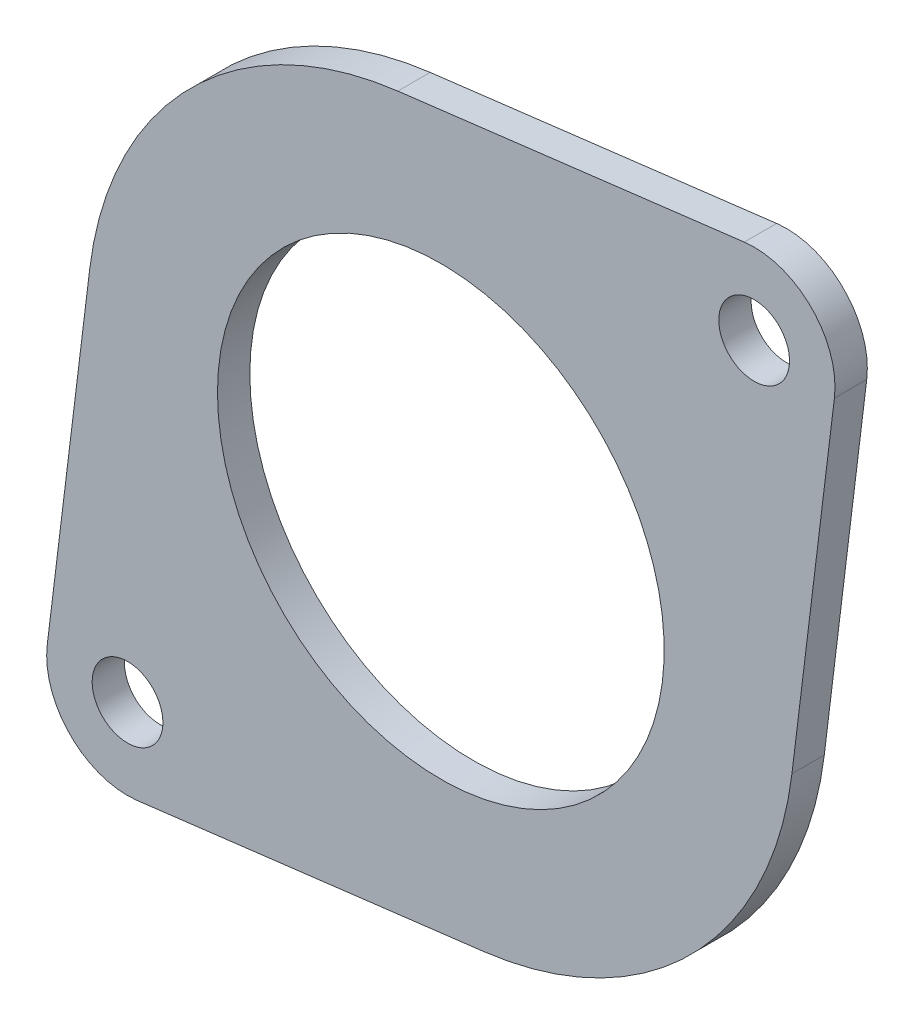
ISO-10303-21;
HEADER;
FILE_DESCRIPTION(('STEP AP214'),'2;1');
FILE_NAME('part.step','',(''),(''),'','','');
FILE_SCHEMA(('AUTOMOTIVE_DESIGN { 1 0 10303 214 1 1 1 1 }'));
ENDSEC;
DATA;
#1=APPLICATION_CONTEXT('core data for automotive mechanical design processes');
#2=APPLICATION_PROTOCOL_DEFINITION('international standard','automotive_design',2000,#1);
#3=PRODUCT_CONTEXT('',#1,'mechanical');
#4=PRODUCT('Part','Part','',(#3));
#5=PRODUCT_RELATED_PRODUCT_CATEGORY('part','',(#4));
#6=PRODUCT_DEFINITION_FORMATION('','',#4);
#7=PRODUCT_DEFINITION_CONTEXT('part definition',#1,'design');
#8=PRODUCT_DEFINITION('design','',#6,#7);
#9=PRODUCT_DEFINITION_SHAPE('','',#8);
#10=(LENGTH_UNIT() NAMED_UNIT(*) SI_UNIT(.MILLI.,.METRE.));
#11=(NAMED_UNIT(*) PLANE_ANGLE_UNIT() SI_UNIT($,.RADIAN.));
#12=(NAMED_UNIT(*) SI_UNIT($,.STERADIAN.) SOLID_ANGLE_UNIT());
#13=UNCERTAINTY_MEASURE_WITH_UNIT(LENGTH_MEASURE(1.E-05),#10,'distance_accuracy_value','');
#14=(GEOMETRIC_REPRESENTATION_CONTEXT(3) GLOBAL_UNCERTAINTY_ASSIGNED_CONTEXT((#13)) GLOBAL_UNIT_ASSIGNED_CONTEXT((#10,
#11,#12)) REPRESENTATION_CONTEXT('',''));
#15=CARTESIAN_POINT('',(0.,0.,0.));
#16=DIRECTION('',(0.,0.,1.));
#17=DIRECTION('',(1.,0.,0.));
#18=AXIS2_PLACEMENT_3D('',#15,#16,#17);
#19=CARTESIAN_POINT('',(0.,0.,0.));
#20=DIRECTION('',(0.,0.,1.));
#21=DIRECTION('',(1.,0.,0.));
#22=AXIS2_PLACEMENT_3D('',#19,#20,#21);
#23=PLANE('',#22);
#24=CARTESIAN_POINT('',(0.,0.,0.));
#25=DIRECTION('',(0.,0.,-1.));
#26=DIRECTION('',(1.,0.,0.));
#27=AXIS2_PLACEMENT_3D('',#24,#25,#26);
#28=CIRCLE('',#27,11.05);
#29=CARTESIAN_POINT('',(-11.05,0.,0.));
#30=VERTEX_POINT('',#29);
#31=EDGE_CURVE('E131',#30,#30,#28,.T.);
#32=ORIENTED_EDGE('',*,*,#31,.F.);
#33=EDGE_LOOP('',(#32));
#34=FACE_BOUND('',#33,.T.);
#35=CARTESIAN_POINT('',(15.5,15.5,0.));
#36=DIRECTION('',(0.,0.,-1.));
#37=DIRECTION('',(1.,0.,0.));
#38=AXIS2_PLACEMENT_3D('',#35,#36,#37);
#39=CIRCLE('',#38,1.75);
#40=CARTESIAN_POINT('',(13.75,15.5,0.));
#41=VERTEX_POINT('',#40);
#42=EDGE_CURVE('E148',#41,#41,#39,.T.);
#43=ORIENTED_EDGE('',*,*,#42,.F.);
#44=EDGE_LOOP('',(#43));
#45=FACE_BOUND('',#44,.T.);
#46=CARTESIAN_POINT('',(-15.5,-15.5,0.));
#47=DIRECTION('',(0.,0.,-1.));
#48=DIRECTION('',(1.,0.,0.));
#49=AXIS2_PLACEMENT_3D('',#46,#47,#48);
#50=CIRCLE('',#49,1.75);
#51=CARTESIAN_POINT('',(-17.25,-15.5,0.));
#52=VERTEX_POINT('',#51);
#53=EDGE_CURVE('E175',#52,#52,#50,.T.);
#54=ORIENTED_EDGE('',*,*,#53,.F.);
#55=EDGE_LOOP('',(#54));
#56=FACE_BOUND('',#55,.T.);
#57=CARTESIAN_POINT('',(15.5,15.5,0.));
#58=DIRECTION('',(0.,0.,1.));
#59=DIRECTION('',(1.,0.,0.));
#60=AXIS2_PLACEMENT_3D('',#57,#58,#59);
#61=CIRCLE('',#60,4.);
#62=CARTESIAN_POINT('',(19.4703117469898,15.0135592207522,0.));
#63=VERTEX_POINT('',#62);
#64=CARTESIAN_POINT('',(15.0135592207522,19.4703117469898,0.));
#65=VERTEX_POINT('',#64);
#66=EDGE_CURVE('E26',#63,#65,#61,.T.);
#67=ORIENTED_EDGE('',*,*,#66,.F.);
#68=DIRECTION('',(-0.121610194811953,-0.992577936747437,0.));
#69=VECTOR('',#68,1.);
#70=CARTESIAN_POINT('',(19.4703117469898,15.0135592207522,0.));
#71=LINE('',#70,#69);
#72=CARTESIAN_POINT('',(17.3701138930801,-2.12817840920918,0.));
#73=VERTEX_POINT('',#72);
#74=EDGE_CURVE('E181',#63,#73,#71,.T.);
#75=ORIENTED_EDGE('',*,*,#74,.T.);
#76=CARTESIAN_POINT('',(0.,0.,0.));
#77=DIRECTION('',(0.,0.,1.));
#78=DIRECTION('',(1.,0.,0.));
#79=AXIS2_PLACEMENT_3D('',#76,#77,#78);
#80=CIRCLE('',#79,17.5);
#81=CARTESIAN_POINT('',(2.12817840920918,-17.3701138930801,0.));
#82=VERTEX_POINT('',#81);
#83=EDGE_CURVE('E178',#82,#73,#80,.T.);
#84=ORIENTED_EDGE('',*,*,#83,.F.);
#85=DIRECTION('',(-0.992577936747437,-0.121610194811953,0.));
#86=VECTOR('',#85,1.);
#87=CARTESIAN_POINT('',(2.12817840920918,-17.3701138930801,0.));
#88=LINE('',#87,#86);
#89=CARTESIAN_POINT('',(-15.0135592207522,-19.4703117469898,0.));
#90=VERTEX_POINT('',#89);
#91=EDGE_CURVE('E170',#82,#90,#88,.T.);
#92=ORIENTED_EDGE('',*,*,#91,.T.);
#93=CARTESIAN_POINT('',(-15.5,-15.5,0.));
#94=DIRECTION('',(0.,0.,1.));
#95=DIRECTION('',(1.,0.,0.));
#96=AXIS2_PLACEMENT_3D('',#93,#94,#95);
#97=CIRCLE('',#96,4.);
#98=CARTESIAN_POINT('',(-19.4703117469898,-15.0135592207522,0.));
#99=VERTEX_POINT('',#98);
#100=EDGE_CURVE('E208',#99,#90,#97,.T.);
#101=ORIENTED_EDGE('',*,*,#100,.F.);
#102=DIRECTION('',(0.121610194811953,0.992577936747437,0.));
#103=VECTOR('',#102,1.);
#104=CARTESIAN_POINT('',(-19.4703117469898,-15.0135592207522,0.));
#105=LINE('',#104,#103);
#106=CARTESIAN_POINT('',(-17.3701138930801,2.12817840920918,0.));
#107=VERTEX_POINT('',#106);
#108=EDGE_CURVE('E215',#99,#107,#105,.T.);
#109=ORIENTED_EDGE('',*,*,#108,.T.);
#110=CARTESIAN_POINT('',(0.,0.,0.));
#111=DIRECTION('',(0.,0.,1.));
#112=DIRECTION('',(1.,0.,0.));
#113=AXIS2_PLACEMENT_3D('',#110,#111,#112);
#114=CIRCLE('',#113,17.5);
#115=CARTESIAN_POINT('',(-2.12817840920918,17.3701138930801,0.));
#116=VERTEX_POINT('',#115);
#117=EDGE_CURVE('E161',#116,#107,#114,.T.);
#118=ORIENTED_EDGE('',*,*,#117,.F.);
#119=DIRECTION('',(0.992577936747437,0.121610194811953,0.));
#120=VECTOR('',#119,1.);
#121=CARTESIAN_POINT('',(-2.12817840920918,17.3701138930801,0.));
#122=LINE('',#121,#120);
#123=EDGE_CURVE('E234',#116,#65,#122,.T.);
#124=ORIENTED_EDGE('',*,*,#123,.T.);
#125=EDGE_LOOP('',(#67,#75,#84,#92,#101,#109,#118,#124));
#126=FACE_BOUND('',#125,.T.);
#127=ADVANCED_FACE('F17',(#34,#45,#56,#126),#23,.F.);
#128=CARTESIAN_POINT('',(0.,0.,1.6));
#129=DIRECTION('',(0.,0.,1.));
#130=DIRECTION('',(1.,0.,0.));
#131=AXIS2_PLACEMENT_3D('',#128,#129,#130);
#132=PLANE('',#131);
#133=CARTESIAN_POINT('',(0.,0.,1.6));
#134=DIRECTION('',(0.,0.,-1.));
#135=DIRECTION('',(1.,0.,0.));
#136=AXIS2_PLACEMENT_3D('',#133,#134,#135);
#137=CIRCLE('',#136,11.05);
#138=CARTESIAN_POINT('',(-11.05,0.,1.6));
#139=VERTEX_POINT('',#138);
#140=EDGE_CURVE('E129',#139,#139,#137,.T.);
#141=ORIENTED_EDGE('',*,*,#140,.T.);
#142=EDGE_LOOP('',(#141));
#143=FACE_BOUND('',#142,.T.);
#144=CARTESIAN_POINT('',(15.5,15.5,1.6));
#145=DIRECTION('',(0.,0.,-1.));
#146=DIRECTION('',(1.,0.,0.));
#147=AXIS2_PLACEMENT_3D('',#144,#145,#146);
#148=CIRCLE('',#147,1.75);
#149=CARTESIAN_POINT('',(13.75,15.5,1.6));
#150=VERTEX_POINT('',#149);
#151=EDGE_CURVE('E154',#150,#150,#148,.T.);
#152=ORIENTED_EDGE('',*,*,#151,.T.);
#153=EDGE_LOOP('',(#152));
#154=FACE_BOUND('',#153,.T.);
#155=CARTESIAN_POINT('',(-15.5,-15.5,1.6));
#156=DIRECTION('',(0.,0.,-1.));
#157=DIRECTION('',(1.,0.,0.));
#158=AXIS2_PLACEMENT_3D('',#155,#156,#157);
#159=CIRCLE('',#158,1.75);
#160=CARTESIAN_POINT('',(-17.25,-15.5,1.6));
#161=VERTEX_POINT('',#160);
#162=EDGE_CURVE('E143',#161,#161,#159,.T.);
#163=ORIENTED_EDGE('',*,*,#162,.T.);
#164=EDGE_LOOP('',(#163));
#165=FACE_BOUND('',#164,.T.);
#166=CARTESIAN_POINT('',(15.5,15.5,1.6));
#167=DIRECTION('',(0.,0.,1.));
#168=DIRECTION('',(1.,0.,0.));
#169=AXIS2_PLACEMENT_3D('',#166,#167,#168);
#170=CIRCLE('',#169,4.);
#171=CARTESIAN_POINT('',(19.4703117469898,15.0135592207522,1.6));
#172=VERTEX_POINT('',#171);
#173=CARTESIAN_POINT('',(15.0135592207522,19.4703117469898,1.6));
#174=VERTEX_POINT('',#173);
#175=EDGE_CURVE('E11',#172,#174,#170,.T.);
#176=ORIENTED_EDGE('',*,*,#175,.T.);
#177=DIRECTION('',(-0.992577936747437,-0.121610194811953,0.));
#178=VECTOR('',#177,1.);
#179=CARTESIAN_POINT('',(-2.12817840920918,17.3701138930801,1.6));
#180=LINE('',#179,#178);
#181=CARTESIAN_POINT('',(-2.12817840920918,17.3701138930801,1.6));
#182=VERTEX_POINT('',#181);
#183=EDGE_CURVE('E238',#174,#182,#180,.T.);
#184=ORIENTED_EDGE('',*,*,#183,.T.);
#185=CARTESIAN_POINT('',(0.,0.,1.6));
#186=DIRECTION('',(0.,0.,1.));
#187=DIRECTION('',(1.,0.,0.));
#188=AXIS2_PLACEMENT_3D('',#185,#186,#187);
#189=CIRCLE('',#188,17.5);
#190=CARTESIAN_POINT('',(-17.3701138930801,2.12817840920918,1.6));
#191=VERTEX_POINT('',#190);
#192=EDGE_CURVE('E164',#182,#191,#189,.T.);
#193=ORIENTED_EDGE('',*,*,#192,.T.);
#194=DIRECTION('',(-0.121610194811953,-0.992577936747437,0.));
#195=VECTOR('',#194,1.);
#196=CARTESIAN_POINT('',(-19.4703117469898,-15.0135592207522,1.6));
#197=LINE('',#196,#195);
#198=CARTESIAN_POINT('',(-19.4703117469898,-15.0135592207522,1.6));
#199=VERTEX_POINT('',#198);
#200=EDGE_CURVE('E222',#191,#199,#197,.T.);
#201=ORIENTED_EDGE('',*,*,#200,.T.);
#202=CARTESIAN_POINT('',(-15.5,-15.5,1.6));
#203=DIRECTION('',(0.,0.,1.));
#204=DIRECTION('',(1.,0.,0.));
#205=AXIS2_PLACEMENT_3D('',#202,#203,#204);
#206=CIRCLE('',#205,4.);
#207=CARTESIAN_POINT('',(-15.0135592207522,-19.4703117469898,1.6));
#208=VERTEX_POINT('',#207);
#209=EDGE_CURVE('E141',#199,#208,#206,.T.);
#210=ORIENTED_EDGE('',*,*,#209,.T.);
#211=DIRECTION('',(0.992577936747437,0.121610194811953,0.));
#212=VECTOR('',#211,1.);
#213=CARTESIAN_POINT('',(2.12817840920918,-17.3701138930801,1.6));
#214=LINE('',#213,#212);
#215=CARTESIAN_POINT('',(2.12817840920918,-17.3701138930801,1.6));
#216=VERTEX_POINT('',#215);
#217=EDGE_CURVE('E185',#208,#216,#214,.T.);
#218=ORIENTED_EDGE('',*,*,#217,.T.);
#219=CARTESIAN_POINT('',(0.,0.,1.6));
#220=DIRECTION('',(0.,0.,1.));
#221=DIRECTION('',(1.,0.,0.));
#222=AXIS2_PLACEMENT_3D('',#219,#220,#221);
#223=CIRCLE('',#222,17.5);
#224=CARTESIAN_POINT('',(17.3701138930801,-2.12817840920918,1.6));
#225=VERTEX_POINT('',#224);
#226=EDGE_CURVE('E171',#216,#225,#223,.T.);
#227=ORIENTED_EDGE('',*,*,#226,.T.);
#228=DIRECTION('',(0.121610194811953,0.992577936747437,0.));
#229=VECTOR('',#228,1.);
#230=CARTESIAN_POINT('',(19.4703117469898,15.0135592207522,1.6));
#231=LINE('',#230,#229);
#232=EDGE_CURVE('E186',#225,#172,#231,.T.);
#233=ORIENTED_EDGE('',*,*,#232,.T.);
#234=EDGE_LOOP('',(#176,#184,#193,#201,#210,#218,#227,#233));
#235=FACE_BOUND('',#234,.T.);
#236=ADVANCED_FACE('F19',(#143,#154,#165,#235),#132,.T.);
#237=CARTESIAN_POINT('',(15.5,15.5,0.));
#238=DIRECTION('',(0.,0.,1.));
#239=DIRECTION('',(1.,0.,0.));
#240=AXIS2_PLACEMENT_3D('',#237,#238,#239);
#241=CYLINDRICAL_SURFACE('',#240,4.);
#242=ORIENTED_EDGE('',*,*,#66,.T.);
#243=DIRECTION('',(0.,0.,1.));
#244=VECTOR('',#243,1.);
#245=CARTESIAN_POINT('',(15.0135592207522,19.4703117469898,0.));
#246=LINE('',#245,#244);
#247=EDGE_CURVE('E218',#65,#174,#246,.T.);
#248=ORIENTED_EDGE('',*,*,#247,.T.);
#249=ORIENTED_EDGE('',*,*,#175,.F.);
#250=DIRECTION('',(0.,0.,1.));
#251=VECTOR('',#250,1.);
#252=CARTESIAN_POINT('',(19.4703117469898,15.0135592207522,0.));
#253=LINE('',#252,#251);
#254=EDGE_CURVE('E190',#63,#172,#253,.T.);
#255=ORIENTED_EDGE('',*,*,#254,.F.);
#256=EDGE_LOOP('',(#242,#248,#249,#255));
#257=FACE_BOUND('',#256,.T.);
#258=ADVANCED_FACE('F243',(#257),#241,.T.);
#259=CARTESIAN_POINT('',(15.0135592207522,19.4703117469898,0.));
#260=DIRECTION('',(-0.121610194811953,0.992577936747437,0.));
#261=DIRECTION('',(0.,0.,1.));
#262=AXIS2_PLACEMENT_3D('',#259,#260,#261);
#263=PLANE('',#262);
#264=ORIENTED_EDGE('',*,*,#123,.F.);
#265=DIRECTION('',(0.,0.,1.));
#266=VECTOR('',#265,1.);
#267=CARTESIAN_POINT('',(-2.12817840920918,17.3701138930801,0.));
#268=LINE('',#267,#266);
#269=EDGE_CURVE('E230',#116,#182,#268,.T.);
#270=ORIENTED_EDGE('',*,*,#269,.T.);
#271=ORIENTED_EDGE('',*,*,#183,.F.);
#272=ORIENTED_EDGE('',*,*,#247,.F.);
#273=EDGE_LOOP('',(#264,#270,#271,#272));
#274=FACE_BOUND('',#273,.T.);
#275=ADVANCED_FACE('F245',(#274),#263,.T.);
#276=CARTESIAN_POINT('',(0.,0.,0.));
#277=DIRECTION('',(0.,0.,1.));
#278=DIRECTION('',(1.,0.,0.));
#279=AXIS2_PLACEMENT_3D('',#276,#277,#278);
#280=CYLINDRICAL_SURFACE('',#279,17.5);
#281=ORIENTED_EDGE('',*,*,#117,.T.);
#282=DIRECTION('',(0.,0.,1.));
#283=VECTOR('',#282,1.);
#284=CARTESIAN_POINT('',(-17.3701138930801,2.12817840920918,0.));
#285=LINE('',#284,#283);
#286=EDGE_CURVE('E165',#107,#191,#285,.T.);
#287=ORIENTED_EDGE('',*,*,#286,.T.);
#288=ORIENTED_EDGE('',*,*,#192,.F.);
#289=ORIENTED_EDGE('',*,*,#269,.F.);
#290=EDGE_LOOP('',(#281,#287,#288,#289));
#291=FACE_BOUND('',#290,.T.);
#292=ADVANCED_FACE('F251',(#291),#280,.T.);
#293=CARTESIAN_POINT('',(-17.3701138930801,2.12817840920918,0.));
#294=DIRECTION('',(-0.992577936747437,0.121610194811953,0.));
#295=DIRECTION('',(0.,0.,1.));
#296=AXIS2_PLACEMENT_3D('',#293,#294,#295);
#297=PLANE('',#296);
#298=ORIENTED_EDGE('',*,*,#108,.F.);
#299=DIRECTION('',(0.,0.,1.));
#300=VECTOR('',#299,1.);
#301=CARTESIAN_POINT('',(-19.4703117469898,-15.0135592207522,0.));
#302=LINE('',#301,#300);
#303=EDGE_CURVE('E211',#99,#199,#302,.T.);
#304=ORIENTED_EDGE('',*,*,#303,.T.);
#305=ORIENTED_EDGE('',*,*,#200,.F.);
#306=ORIENTED_EDGE('',*,*,#286,.F.);
#307=EDGE_LOOP('',(#298,#304,#305,#306));
#308=FACE_BOUND('',#307,.T.);
#309=ADVANCED_FACE('F254',(#308),#297,.T.);
#310=CARTESIAN_POINT('',(-15.5,-15.5,0.));
#311=DIRECTION('',(0.,0.,1.));
#312=DIRECTION('',(-0.707106781186548,-0.707106781186547,0.));
#313=AXIS2_PLACEMENT_3D('',#310,#311,#312);
#314=CYLINDRICAL_SURFACE('',#313,4.);
#315=ORIENTED_EDGE('',*,*,#100,.T.);
#316=DIRECTION('',(0.,0.,1.));
#317=VECTOR('',#316,1.);
#318=CARTESIAN_POINT('',(-15.0135592207522,-19.4703117469898,0.));
#319=LINE('',#318,#317);
#320=EDGE_CURVE('E201',#90,#208,#319,.T.);
#321=ORIENTED_EDGE('',*,*,#320,.T.);
#322=ORIENTED_EDGE('',*,*,#209,.F.);
#323=ORIENTED_EDGE('',*,*,#303,.F.);
#324=EDGE_LOOP('',(#315,#321,#322,#323));
#325=FACE_BOUND('',#324,.T.);
#326=ADVANCED_FACE('F259',(#325),#314,.T.);
#327=CARTESIAN_POINT('',(-15.0135592207522,-19.4703117469898,0.));
#328=DIRECTION('',(0.121610194811953,-0.992577936747437,0.));
#329=DIRECTION('',(0.,0.,-1.));
#330=AXIS2_PLACEMENT_3D('',#327,#328,#329);
#331=PLANE('',#330);
#332=ORIENTED_EDGE('',*,*,#91,.F.);
#333=DIRECTION('',(0.,0.,1.));
#334=VECTOR('',#333,1.);
#335=CARTESIAN_POINT('',(2.12817840920918,-17.3701138930801,0.));
#336=LINE('',#335,#334);
#337=EDGE_CURVE('E166',#82,#216,#336,.T.);
#338=ORIENTED_EDGE('',*,*,#337,.T.);
#339=ORIENTED_EDGE('',*,*,#217,.F.);
#340=ORIENTED_EDGE('',*,*,#320,.F.);
#341=EDGE_LOOP('',(#332,#338,#339,#340));
#342=FACE_BOUND('',#341,.T.);
#343=ADVANCED_FACE('F268',(#342),#331,.T.);
#344=CARTESIAN_POINT('',(0.,0.,0.));
#345=DIRECTION('',(0.,0.,1.));
#346=DIRECTION('',(1.,0.,0.));
#347=AXIS2_PLACEMENT_3D('',#344,#345,#346);
#348=CYLINDRICAL_SURFACE('',#347,17.5);
#349=ORIENTED_EDGE('',*,*,#83,.T.);
#350=DIRECTION('',(0.,0.,1.));
#351=VECTOR('',#350,1.);
#352=CARTESIAN_POINT('',(17.3701138930801,-2.12817840920918,0.));
#353=LINE('',#352,#351);
#354=EDGE_CURVE('E189',#73,#225,#353,.T.);
#355=ORIENTED_EDGE('',*,*,#354,.T.);
#356=ORIENTED_EDGE('',*,*,#226,.F.);
#357=ORIENTED_EDGE('',*,*,#337,.F.);
#358=EDGE_LOOP('',(#349,#355,#356,#357));
#359=FACE_BOUND('',#358,.T.);
#360=ADVANCED_FACE('F271',(#359),#348,.T.);
#361=CARTESIAN_POINT('',(17.3701138930801,-2.12817840920918,0.));
#362=DIRECTION('',(0.992577936747437,-0.121610194811953,0.));
#363=DIRECTION('',(0.,0.,-1.));
#364=AXIS2_PLACEMENT_3D('',#361,#362,#363);
#365=PLANE('',#364);
#366=ORIENTED_EDGE('',*,*,#74,.F.);
#367=ORIENTED_EDGE('',*,*,#254,.T.);
#368=ORIENTED_EDGE('',*,*,#232,.F.);
#369=ORIENTED_EDGE('',*,*,#354,.F.);
#370=EDGE_LOOP('',(#366,#367,#368,#369));
#371=FACE_BOUND('',#370,.T.);
#372=ADVANCED_FACE('F276',(#371),#365,.T.);
#373=CARTESIAN_POINT('',(-15.5,-15.5,0.));
#374=DIRECTION('',(0.,0.,1.));
#375=DIRECTION('',(1.,0.,0.));
#376=AXIS2_PLACEMENT_3D('',#373,#374,#375);
#377=CYLINDRICAL_SURFACE('',#376,1.75);
#378=ORIENTED_EDGE('',*,*,#162,.F.);
#379=DIRECTION('',(0.,0.,-1.));
#380=VECTOR('',#379,1.);
#381=CARTESIAN_POINT('',(-17.25,-15.5,0.));
#382=LINE('',#381,#380);
#383=EDGE_CURVE('E147',#161,#52,#382,.T.);
#384=ORIENTED_EDGE('',*,*,#383,.T.);
#385=ORIENTED_EDGE('',*,*,#53,.T.);
#386=ORIENTED_EDGE('',*,*,#383,.F.);
#387=EDGE_LOOP('',(#378,#384,#385,#386));
#388=FACE_BOUND('',#387,.T.);
#389=ADVANCED_FACE('F288',(#388),#377,.F.);
#390=CARTESIAN_POINT('',(15.5,15.5,0.));
#391=DIRECTION('',(0.,0.,1.));
#392=DIRECTION('',(1.,0.,0.));
#393=AXIS2_PLACEMENT_3D('',#390,#391,#392);
#394=CYLINDRICAL_SURFACE('',#393,1.75);
#395=ORIENTED_EDGE('',*,*,#151,.F.);
#396=DIRECTION('',(0.,0.,-1.));
#397=VECTOR('',#396,1.);
#398=CARTESIAN_POINT('',(13.75,15.5,0.));
#399=LINE('',#398,#397);
#400=EDGE_CURVE('E151',#150,#41,#399,.T.);
#401=ORIENTED_EDGE('',*,*,#400,.T.);
#402=ORIENTED_EDGE('',*,*,#42,.T.);
#403=ORIENTED_EDGE('',*,*,#400,.F.);
#404=EDGE_LOOP('',(#395,#401,#402,#403));
#405=FACE_BOUND('',#404,.T.);
#406=ADVANCED_FACE('F352',(#405),#394,.F.);
#407=CARTESIAN_POINT('',(0.,0.,0.));
#408=DIRECTION('',(0.,0.,1.));
#409=DIRECTION('',(1.,0.,0.));
#410=AXIS2_PLACEMENT_3D('',#407,#408,#409);
#411=CYLINDRICAL_SURFACE('',#410,11.05);
#412=ORIENTED_EDGE('',*,*,#140,.F.);
#413=DIRECTION('',(0.,0.,-1.));
#414=VECTOR('',#413,1.);
#415=CARTESIAN_POINT('',(-11.05,0.,0.));
#416=LINE('',#415,#414);
#417=EDGE_CURVE('E126',#139,#30,#416,.T.);
#418=ORIENTED_EDGE('',*,*,#417,.T.);
#419=ORIENTED_EDGE('',*,*,#31,.T.);
#420=ORIENTED_EDGE('',*,*,#417,.F.);
#421=EDGE_LOOP('',(#412,#418,#419,#420));
#422=FACE_BOUND('',#421,.T.);
#423=ADVANCED_FACE('F128',(#422),#411,.F.);
#424=CLOSED_SHELL('',(#127,#236,#258,#275,#292,#309,#326,#343,#360,#372,#389,#406,#423));
#425=MANIFOLD_SOLID_BREP('B1',#424);
#426=ADVANCED_BREP_SHAPE_REPRESENTATION('',(#18,#425),#14);
#427=SHAPE_DEFINITION_REPRESENTATION(#9,#426);
ENDSEC;
END-ISO-10303-21;
